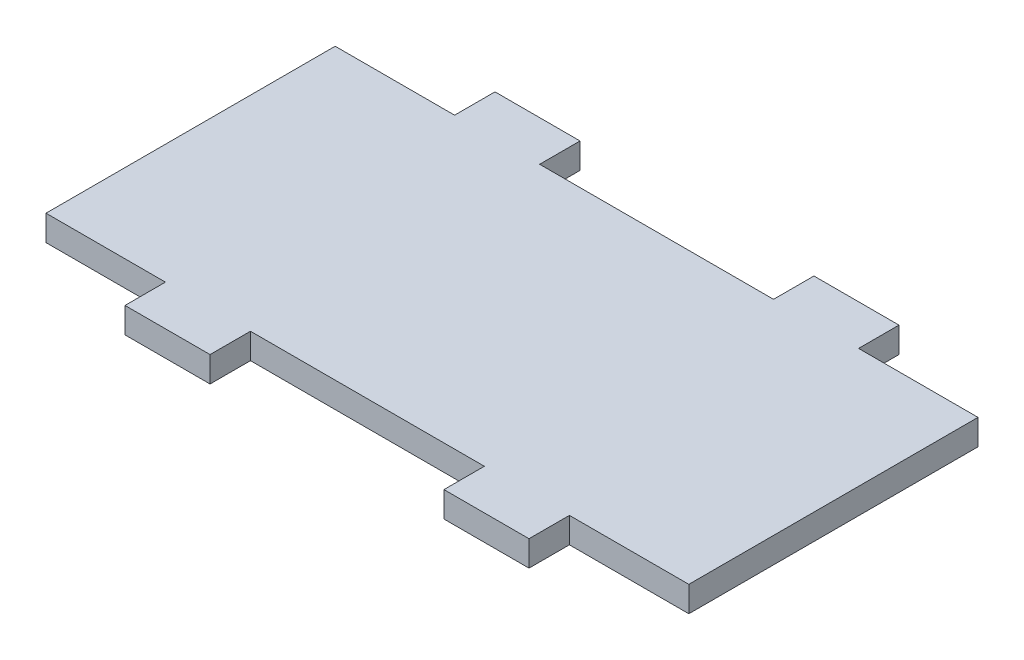
ISO-10303-21;
HEADER;
FILE_DESCRIPTION(('STEP AP214'),'2;1');
FILE_NAME('part.step','',(''),(''),'','','');
FILE_SCHEMA(('AUTOMOTIVE_DESIGN { 1 0 10303 214 1 1 1 1 }'));
ENDSEC;
DATA;
#1=APPLICATION_CONTEXT('core data for automotive mechanical design processes');
#2=APPLICATION_PROTOCOL_DEFINITION('international standard','automotive_design',2000,#1);
#3=PRODUCT_CONTEXT('',#1,'mechanical');
#4=PRODUCT('Part','Part','',(#3));
#5=PRODUCT_RELATED_PRODUCT_CATEGORY('part','',(#4));
#6=PRODUCT_DEFINITION_FORMATION('','',#4);
#7=PRODUCT_DEFINITION_CONTEXT('part definition',#1,'design');
#8=PRODUCT_DEFINITION('design','',#6,#7);
#9=PRODUCT_DEFINITION_SHAPE('','',#8);
#10=(LENGTH_UNIT() NAMED_UNIT(*) SI_UNIT(.MILLI.,.METRE.));
#11=(NAMED_UNIT(*) PLANE_ANGLE_UNIT() SI_UNIT($,.RADIAN.));
#12=(NAMED_UNIT(*) SI_UNIT($,.STERADIAN.) SOLID_ANGLE_UNIT());
#13=UNCERTAINTY_MEASURE_WITH_UNIT(LENGTH_MEASURE(1.E-05),#10,'distance_accuracy_value','');
#14=(GEOMETRIC_REPRESENTATION_CONTEXT(3) GLOBAL_UNCERTAINTY_ASSIGNED_CONTEXT((#13)) GLOBAL_UNIT_ASSIGNED_CONTEXT((#10,
#11,#12)) REPRESENTATION_CONTEXT('',''));
#15=CARTESIAN_POINT('',(0.,0.,0.));
#16=DIRECTION('',(0.,0.,1.));
#17=DIRECTION('',(1.,0.,0.));
#18=AXIS2_PLACEMENT_3D('',#15,#16,#17);
#19=CARTESIAN_POINT('',(13.75,3.,0.));
#20=DIRECTION('',(-1.,0.,0.));
#21=DIRECTION('',(0.,0.,1.));
#22=AXIS2_PLACEMENT_3D('',#19,#20,#21);
#23=PLANE('',#22);
#24=DIRECTION('',(0.,0.,-1.));
#25=VECTOR('',#24,1.);
#26=CARTESIAN_POINT('',(13.75,0.,0.));
#27=LINE('',#26,#25);
#28=CARTESIAN_POINT('',(13.75,0.,-17.));
#29=VERTEX_POINT('',#28);
#30=CARTESIAN_POINT('',(13.75,0.,-21.75));
#31=VERTEX_POINT('',#30);
#32=EDGE_CURVE('E212',#29,#31,#27,.T.);
#33=ORIENTED_EDGE('',*,*,#32,.F.);
#34=DIRECTION('',(0.,-1.,0.));
#35=VECTOR('',#34,1.);
#36=CARTESIAN_POINT('',(13.75,3.,-17.));
#37=LINE('',#36,#35);
#38=CARTESIAN_POINT('',(13.75,3.,-17.));
#39=VERTEX_POINT('',#38);
#40=EDGE_CURVE('E11',#39,#29,#37,.T.);
#41=ORIENTED_EDGE('',*,*,#40,.F.);
#42=DIRECTION('',(0.,0.,-1.));
#43=VECTOR('',#42,1.);
#44=CARTESIAN_POINT('',(13.75,3.,0.));
#45=LINE('',#44,#43);
#46=CARTESIAN_POINT('',(13.75,3.,-21.75));
#47=VERTEX_POINT('',#46);
#48=EDGE_CURVE('E283',#39,#47,#45,.T.);
#49=ORIENTED_EDGE('',*,*,#48,.T.);
#50=DIRECTION('',(0.,-1.,0.));
#51=VECTOR('',#50,1.);
#52=CARTESIAN_POINT('',(13.75,3.,-21.75));
#53=LINE('',#52,#51);
#54=EDGE_CURVE('E57',#47,#31,#53,.T.);
#55=ORIENTED_EDGE('',*,*,#54,.T.);
#56=EDGE_LOOP('',(#33,#41,#49,#55));
#57=FACE_BOUND('',#56,.T.);
#58=ADVANCED_FACE('F40',(#57),#23,.T.);
#59=CARTESIAN_POINT('',(0.,3.,-17.));
#60=DIRECTION('',(0.,0.,1.));
#61=DIRECTION('',(1.,0.,0.));
#62=AXIS2_PLACEMENT_3D('',#59,#60,#61);
#63=PLANE('',#62);
#64=DIRECTION('',(-1.,0.,0.));
#65=VECTOR('',#64,1.);
#66=CARTESIAN_POINT('',(0.,0.,-17.));
#67=LINE('',#66,#65);
#68=CARTESIAN_POINT('',(-13.75,0.,-17.));
#69=VERTEX_POINT('',#68);
#70=EDGE_CURVE('E215',#29,#69,#67,.T.);
#71=ORIENTED_EDGE('',*,*,#70,.T.);
#72=DIRECTION('',(0.,-1.,0.));
#73=VECTOR('',#72,1.);
#74=CARTESIAN_POINT('',(-13.75,3.,-17.));
#75=LINE('',#74,#73);
#76=CARTESIAN_POINT('',(-13.75,3.,-17.));
#77=VERTEX_POINT('',#76);
#78=EDGE_CURVE('E49',#77,#69,#75,.T.);
#79=ORIENTED_EDGE('',*,*,#78,.F.);
#80=DIRECTION('',(-1.,0.,0.));
#81=VECTOR('',#80,1.);
#82=CARTESIAN_POINT('',(0.,3.,-17.));
#83=LINE('',#82,#81);
#84=EDGE_CURVE('E364',#39,#77,#83,.T.);
#85=ORIENTED_EDGE('',*,*,#84,.F.);
#86=ORIENTED_EDGE('',*,*,#40,.T.);
#87=EDGE_LOOP('',(#71,#79,#85,#86));
#88=FACE_BOUND('',#87,.T.);
#89=ADVANCED_FACE('F427',(#88),#63,.F.);
#90=CARTESIAN_POINT('',(-13.75,3.,0.));
#91=DIRECTION('',(-1.,0.,0.));
#92=DIRECTION('',(0.,0.,1.));
#93=AXIS2_PLACEMENT_3D('',#90,#91,#92);
#94=PLANE('',#93);
#95=DIRECTION('',(0.,0.,-1.));
#96=VECTOR('',#95,1.);
#97=CARTESIAN_POINT('',(-13.75,0.,0.));
#98=LINE('',#97,#96);
#99=CARTESIAN_POINT('',(-13.75,0.,-21.75));
#100=VERTEX_POINT('',#99);
#101=EDGE_CURVE('E218',#69,#100,#98,.T.);
#102=ORIENTED_EDGE('',*,*,#101,.T.);
#103=DIRECTION('',(0.,-1.,0.));
#104=VECTOR('',#103,1.);
#105=CARTESIAN_POINT('',(-13.75,3.,-21.75));
#106=LINE('',#105,#104);
#107=CARTESIAN_POINT('',(-13.75,3.,-21.75));
#108=VERTEX_POINT('',#107);
#109=EDGE_CURVE('E332',#108,#100,#106,.T.);
#110=ORIENTED_EDGE('',*,*,#109,.F.);
#111=DIRECTION('',(0.,0.,-1.));
#112=VECTOR('',#111,1.);
#113=CARTESIAN_POINT('',(-13.75,3.,0.));
#114=LINE('',#113,#112);
#115=EDGE_CURVE('E342',#77,#108,#114,.T.);
#116=ORIENTED_EDGE('',*,*,#115,.F.);
#117=ORIENTED_EDGE('',*,*,#78,.T.);
#118=EDGE_LOOP('',(#102,#110,#116,#117));
#119=FACE_BOUND('',#118,.T.);
#120=ADVANCED_FACE('F340',(#119),#94,.F.);
#121=CARTESIAN_POINT('',(0.,3.,-21.75));
#122=DIRECTION('',(0.,0.,-1.));
#123=DIRECTION('',(-1.,0.,0.));
#124=AXIS2_PLACEMENT_3D('',#121,#122,#123);
#125=PLANE('',#124);
#126=DIRECTION('',(1.,0.,0.));
#127=VECTOR('',#126,1.);
#128=CARTESIAN_POINT('',(0.,0.,-21.75));
#129=LINE('',#128,#127);
#130=CARTESIAN_POINT('',(-23.75,0.,-21.75));
#131=VERTEX_POINT('',#130);
#132=EDGE_CURVE('E222',#131,#100,#129,.T.);
#133=ORIENTED_EDGE('',*,*,#132,.F.);
#134=DIRECTION('',(0.,-1.,0.));
#135=VECTOR('',#134,1.);
#136=CARTESIAN_POINT('',(-23.75,3.,-21.75));
#137=LINE('',#136,#135);
#138=CARTESIAN_POINT('',(-23.75,3.,-21.75));
#139=VERTEX_POINT('',#138);
#140=EDGE_CURVE('E329',#139,#131,#137,.T.);
#141=ORIENTED_EDGE('',*,*,#140,.F.);
#142=DIRECTION('',(1.,0.,0.));
#143=VECTOR('',#142,1.);
#144=CARTESIAN_POINT('',(0.,3.,-21.75));
#145=LINE('',#144,#143);
#146=EDGE_CURVE('E354',#139,#108,#145,.T.);
#147=ORIENTED_EDGE('',*,*,#146,.T.);
#148=ORIENTED_EDGE('',*,*,#109,.T.);
#149=EDGE_LOOP('',(#133,#141,#147,#148));
#150=FACE_BOUND('',#149,.T.);
#151=ADVANCED_FACE('F351',(#150),#125,.T.);
#152=CARTESIAN_POINT('',(-23.75,3.,0.));
#153=DIRECTION('',(-1.,0.,0.));
#154=DIRECTION('',(0.,0.,1.));
#155=AXIS2_PLACEMENT_3D('',#152,#153,#154);
#156=PLANE('',#155);
#157=DIRECTION('',(0.,0.,-1.));
#158=VECTOR('',#157,1.);
#159=CARTESIAN_POINT('',(-23.75,0.,0.));
#160=LINE('',#159,#158);
#161=CARTESIAN_POINT('',(-23.75,0.,-17.));
#162=VERTEX_POINT('',#161);
#163=EDGE_CURVE('E226',#162,#131,#160,.T.);
#164=ORIENTED_EDGE('',*,*,#163,.F.);
#165=DIRECTION('',(0.,-1.,0.));
#166=VECTOR('',#165,1.);
#167=CARTESIAN_POINT('',(-23.75,3.,-17.));
#168=LINE('',#167,#166);
#169=CARTESIAN_POINT('',(-23.75,3.,-17.));
#170=VERTEX_POINT('',#169);
#171=EDGE_CURVE('E326',#170,#162,#168,.T.);
#172=ORIENTED_EDGE('',*,*,#171,.F.);
#173=DIRECTION('',(0.,0.,-1.));
#174=VECTOR('',#173,1.);
#175=CARTESIAN_POINT('',(-23.75,3.,0.));
#176=LINE('',#175,#174);
#177=EDGE_CURVE('E358',#170,#139,#176,.T.);
#178=ORIENTED_EDGE('',*,*,#177,.T.);
#179=ORIENTED_EDGE('',*,*,#140,.T.);
#180=EDGE_LOOP('',(#164,#172,#178,#179));
#181=FACE_BOUND('',#180,.T.);
#182=ADVANCED_FACE('F575',(#181),#156,.T.);
#183=CARTESIAN_POINT('',(0.,3.,-17.));
#184=DIRECTION('',(0.,0.,1.));
#185=DIRECTION('',(1.,0.,0.));
#186=AXIS2_PLACEMENT_3D('',#183,#184,#185);
#187=PLANE('',#186);
#188=DIRECTION('',(-1.,0.,0.));
#189=VECTOR('',#188,1.);
#190=CARTESIAN_POINT('',(0.,0.,-17.));
#191=LINE('',#190,#189);
#192=CARTESIAN_POINT('',(-37.79,0.,-17.));
#193=VERTEX_POINT('',#192);
#194=EDGE_CURVE('E230',#162,#193,#191,.T.);
#195=ORIENTED_EDGE('',*,*,#194,.T.);
#196=DIRECTION('',(0.,-1.,0.));
#197=VECTOR('',#196,1.);
#198=CARTESIAN_POINT('',(-37.79,3.,-17.));
#199=LINE('',#198,#197);
#200=CARTESIAN_POINT('',(-37.79,3.,-17.));
#201=VERTEX_POINT('',#200);
#202=EDGE_CURVE('E323',#201,#193,#199,.T.);
#203=ORIENTED_EDGE('',*,*,#202,.F.);
#204=DIRECTION('',(-1.,0.,0.));
#205=VECTOR('',#204,1.);
#206=CARTESIAN_POINT('',(0.,3.,-17.));
#207=LINE('',#206,#205);
#208=EDGE_CURVE('E362',#170,#201,#207,.T.);
#209=ORIENTED_EDGE('',*,*,#208,.F.);
#210=ORIENTED_EDGE('',*,*,#171,.T.);
#211=EDGE_LOOP('',(#195,#203,#209,#210));
#212=FACE_BOUND('',#211,.T.);
#213=ADVANCED_FACE('F565',(#212),#187,.F.);
#214=CARTESIAN_POINT('',(-37.79,3.,0.));
#215=DIRECTION('',(-1.,0.,0.));
#216=DIRECTION('',(0.,0.,1.));
#217=AXIS2_PLACEMENT_3D('',#214,#215,#216);
#218=PLANE('',#217);
#219=DIRECTION('',(0.,0.,-1.));
#220=VECTOR('',#219,1.);
#221=CARTESIAN_POINT('',(-37.79,0.,0.));
#222=LINE('',#221,#220);
#223=CARTESIAN_POINT('',(-37.79,0.,17.));
#224=VERTEX_POINT('',#223);
#225=EDGE_CURVE('E234',#224,#193,#222,.T.);
#226=ORIENTED_EDGE('',*,*,#225,.F.);
#227=DIRECTION('',(0.,-1.,0.));
#228=VECTOR('',#227,1.);
#229=CARTESIAN_POINT('',(-37.79,3.,17.));
#230=LINE('',#229,#228);
#231=CARTESIAN_POINT('',(-37.79,3.,17.));
#232=VERTEX_POINT('',#231);
#233=EDGE_CURVE('E320',#232,#224,#230,.T.);
#234=ORIENTED_EDGE('',*,*,#233,.F.);
#235=DIRECTION('',(0.,0.,-1.));
#236=VECTOR('',#235,1.);
#237=CARTESIAN_POINT('',(-37.79,3.,0.));
#238=LINE('',#237,#236);
#239=EDGE_CURVE('E370',#232,#201,#238,.T.);
#240=ORIENTED_EDGE('',*,*,#239,.T.);
#241=ORIENTED_EDGE('',*,*,#202,.T.);
#242=EDGE_LOOP('',(#226,#234,#240,#241));
#243=FACE_BOUND('',#242,.T.);
#244=ADVANCED_FACE('F554',(#243),#218,.T.);
#245=CARTESIAN_POINT('',(0.,3.,17.));
#246=DIRECTION('',(0.,0.,-1.));
#247=DIRECTION('',(-1.,0.,0.));
#248=AXIS2_PLACEMENT_3D('',#245,#246,#247);
#249=PLANE('',#248);
#250=DIRECTION('',(1.,0.,0.));
#251=VECTOR('',#250,1.);
#252=CARTESIAN_POINT('',(0.,0.,17.));
#253=LINE('',#252,#251);
#254=CARTESIAN_POINT('',(-23.75,0.,17.));
#255=VERTEX_POINT('',#254);
#256=EDGE_CURVE('E238',#224,#255,#253,.T.);
#257=ORIENTED_EDGE('',*,*,#256,.T.);
#258=DIRECTION('',(0.,-1.,0.));
#259=VECTOR('',#258,1.);
#260=CARTESIAN_POINT('',(-23.75,3.,17.));
#261=LINE('',#260,#259);
#262=CARTESIAN_POINT('',(-23.75,3.,17.));
#263=VERTEX_POINT('',#262);
#264=EDGE_CURVE('E316',#263,#255,#261,.T.);
#265=ORIENTED_EDGE('',*,*,#264,.F.);
#266=DIRECTION('',(1.,0.,0.));
#267=VECTOR('',#266,1.);
#268=CARTESIAN_POINT('',(0.,3.,17.));
#269=LINE('',#268,#267);
#270=EDGE_CURVE('E374',#232,#263,#269,.T.);
#271=ORIENTED_EDGE('',*,*,#270,.F.);
#272=ORIENTED_EDGE('',*,*,#233,.T.);
#273=EDGE_LOOP('',(#257,#265,#271,#272));
#274=FACE_BOUND('',#273,.T.);
#275=ADVANCED_FACE('F544',(#274),#249,.F.);
#276=CARTESIAN_POINT('',(-23.75,3.,0.));
#277=DIRECTION('',(1.,0.,0.));
#278=DIRECTION('',(0.,0.,-1.));
#279=AXIS2_PLACEMENT_3D('',#276,#277,#278);
#280=PLANE('',#279);
#281=DIRECTION('',(0.,0.,1.));
#282=VECTOR('',#281,1.);
#283=CARTESIAN_POINT('',(-23.75,0.,0.));
#284=LINE('',#283,#282);
#285=CARTESIAN_POINT('',(-23.75,0.,21.75));
#286=VERTEX_POINT('',#285);
#287=EDGE_CURVE('E241',#255,#286,#284,.T.);
#288=ORIENTED_EDGE('',*,*,#287,.T.);
#289=DIRECTION('',(0.,-1.,0.));
#290=VECTOR('',#289,1.);
#291=CARTESIAN_POINT('',(-23.75,3.,21.75));
#292=LINE('',#291,#290);
#293=CARTESIAN_POINT('',(-23.75,3.,21.75));
#294=VERTEX_POINT('',#293);
#295=EDGE_CURVE('E312',#294,#286,#292,.T.);
#296=ORIENTED_EDGE('',*,*,#295,.F.);
#297=DIRECTION('',(0.,0.,1.));
#298=VECTOR('',#297,1.);
#299=CARTESIAN_POINT('',(-23.75,3.,0.));
#300=LINE('',#299,#298);
#301=EDGE_CURVE('E377',#263,#294,#300,.T.);
#302=ORIENTED_EDGE('',*,*,#301,.F.);
#303=ORIENTED_EDGE('',*,*,#264,.T.);
#304=EDGE_LOOP('',(#288,#296,#302,#303));
#305=FACE_BOUND('',#304,.T.);
#306=ADVANCED_FACE('F534',(#305),#280,.F.);
#307=CARTESIAN_POINT('',(0.,3.,21.75));
#308=DIRECTION('',(0.,0.,-1.));
#309=DIRECTION('',(-1.,0.,0.));
#310=AXIS2_PLACEMENT_3D('',#307,#308,#309);
#311=PLANE('',#310);
#312=DIRECTION('',(1.,0.,0.));
#313=VECTOR('',#312,1.);
#314=CARTESIAN_POINT('',(0.,0.,21.75));
#315=LINE('',#314,#313);
#316=CARTESIAN_POINT('',(-13.75,0.,21.75));
#317=VERTEX_POINT('',#316);
#318=EDGE_CURVE('E244',#286,#317,#315,.T.);
#319=ORIENTED_EDGE('',*,*,#318,.T.);
#320=DIRECTION('',(0.,-1.,0.));
#321=VECTOR('',#320,1.);
#322=CARTESIAN_POINT('',(-13.75,3.,21.75));
#323=LINE('',#322,#321);
#324=CARTESIAN_POINT('',(-13.75,3.,21.75));
#325=VERTEX_POINT('',#324);
#326=EDGE_CURVE('E309',#325,#317,#323,.T.);
#327=ORIENTED_EDGE('',*,*,#326,.F.);
#328=DIRECTION('',(1.,0.,0.));
#329=VECTOR('',#328,1.);
#330=CARTESIAN_POINT('',(0.,3.,21.75));
#331=LINE('',#330,#329);
#332=EDGE_CURVE('E380',#294,#325,#331,.T.);
#333=ORIENTED_EDGE('',*,*,#332,.F.);
#334=ORIENTED_EDGE('',*,*,#295,.T.);
#335=EDGE_LOOP('',(#319,#327,#333,#334));
#336=FACE_BOUND('',#335,.T.);
#337=ADVANCED_FACE('F524',(#336),#311,.F.);
#338=CARTESIAN_POINT('',(-13.75,3.,0.));
#339=DIRECTION('',(1.,0.,0.));
#340=DIRECTION('',(0.,0.,-1.));
#341=AXIS2_PLACEMENT_3D('',#338,#339,#340);
#342=PLANE('',#341);
#343=DIRECTION('',(0.,0.,1.));
#344=VECTOR('',#343,1.);
#345=CARTESIAN_POINT('',(-13.75,0.,0.));
#346=LINE('',#345,#344);
#347=CARTESIAN_POINT('',(-13.75,0.,17.));
#348=VERTEX_POINT('',#347);
#349=EDGE_CURVE('E248',#348,#317,#346,.T.);
#350=ORIENTED_EDGE('',*,*,#349,.F.);
#351=DIRECTION('',(0.,-1.,0.));
#352=VECTOR('',#351,1.);
#353=CARTESIAN_POINT('',(-13.75,3.,17.));
#354=LINE('',#353,#352);
#355=CARTESIAN_POINT('',(-13.75,3.,17.));
#356=VERTEX_POINT('',#355);
#357=EDGE_CURVE('E306',#356,#348,#354,.T.);
#358=ORIENTED_EDGE('',*,*,#357,.F.);
#359=DIRECTION('',(0.,0.,1.));
#360=VECTOR('',#359,1.);
#361=CARTESIAN_POINT('',(-13.75,3.,0.));
#362=LINE('',#361,#360);
#363=EDGE_CURVE('E383',#356,#325,#362,.T.);
#364=ORIENTED_EDGE('',*,*,#363,.T.);
#365=ORIENTED_EDGE('',*,*,#326,.T.);
#366=EDGE_LOOP('',(#350,#358,#364,#365));
#367=FACE_BOUND('',#366,.T.);
#368=ADVANCED_FACE('F513',(#367),#342,.T.);
#369=CARTESIAN_POINT('',(0.,3.,17.));
#370=DIRECTION('',(0.,0.,1.));
#371=DIRECTION('',(1.,0.,0.));
#372=AXIS2_PLACEMENT_3D('',#369,#370,#371);
#373=PLANE('',#372);
#374=DIRECTION('',(-1.,0.,0.));
#375=VECTOR('',#374,1.);
#376=CARTESIAN_POINT('',(0.,0.,17.));
#377=LINE('',#376,#375);
#378=CARTESIAN_POINT('',(13.75,0.,17.));
#379=VERTEX_POINT('',#378);
#380=EDGE_CURVE('E252',#379,#348,#377,.T.);
#381=ORIENTED_EDGE('',*,*,#380,.F.);
#382=DIRECTION('',(0.,-1.,0.));
#383=VECTOR('',#382,1.);
#384=CARTESIAN_POINT('',(13.75,3.,17.));
#385=LINE('',#384,#383);
#386=CARTESIAN_POINT('',(13.75,3.,17.));
#387=VERTEX_POINT('',#386);
#388=EDGE_CURVE('E303',#387,#379,#385,.T.);
#389=ORIENTED_EDGE('',*,*,#388,.F.);
#390=DIRECTION('',(-1.,0.,0.));
#391=VECTOR('',#390,1.);
#392=CARTESIAN_POINT('',(0.,3.,17.));
#393=LINE('',#392,#391);
#394=EDGE_CURVE('E387',#387,#356,#393,.T.);
#395=ORIENTED_EDGE('',*,*,#394,.T.);
#396=ORIENTED_EDGE('',*,*,#357,.T.);
#397=EDGE_LOOP('',(#381,#389,#395,#396));
#398=FACE_BOUND('',#397,.T.);
#399=ADVANCED_FACE('F503',(#398),#373,.T.);
#400=CARTESIAN_POINT('',(13.75,3.,0.));
#401=DIRECTION('',(1.,0.,0.));
#402=DIRECTION('',(0.,0.,-1.));
#403=AXIS2_PLACEMENT_3D('',#400,#401,#402);
#404=PLANE('',#403);
#405=DIRECTION('',(0.,0.,1.));
#406=VECTOR('',#405,1.);
#407=CARTESIAN_POINT('',(13.75,0.,0.));
#408=LINE('',#407,#406);
#409=CARTESIAN_POINT('',(13.75,0.,21.75));
#410=VERTEX_POINT('',#409);
#411=EDGE_CURVE('E256',#379,#410,#408,.T.);
#412=ORIENTED_EDGE('',*,*,#411,.T.);
#413=DIRECTION('',(0.,-1.,0.));
#414=VECTOR('',#413,1.);
#415=CARTESIAN_POINT('',(13.75,3.,21.75));
#416=LINE('',#415,#414);
#417=CARTESIAN_POINT('',(13.75,3.,21.75));
#418=VERTEX_POINT('',#417);
#419=EDGE_CURVE('E299',#418,#410,#416,.T.);
#420=ORIENTED_EDGE('',*,*,#419,.F.);
#421=DIRECTION('',(0.,0.,1.));
#422=VECTOR('',#421,1.);
#423=CARTESIAN_POINT('',(13.75,3.,0.));
#424=LINE('',#423,#422);
#425=EDGE_CURVE('E391',#387,#418,#424,.T.);
#426=ORIENTED_EDGE('',*,*,#425,.F.);
#427=ORIENTED_EDGE('',*,*,#388,.T.);
#428=EDGE_LOOP('',(#412,#420,#426,#427));
#429=FACE_BOUND('',#428,.T.);
#430=ADVANCED_FACE('F493',(#429),#404,.F.);
#431=CARTESIAN_POINT('',(0.,3.,21.75));
#432=DIRECTION('',(0.,0.,-1.));
#433=DIRECTION('',(-1.,0.,0.));
#434=AXIS2_PLACEMENT_3D('',#431,#432,#433);
#435=PLANE('',#434);
#436=DIRECTION('',(1.,0.,0.));
#437=VECTOR('',#436,1.);
#438=CARTESIAN_POINT('',(0.,0.,21.75));
#439=LINE('',#438,#437);
#440=CARTESIAN_POINT('',(23.75,0.,21.75));
#441=VERTEX_POINT('',#440);
#442=EDGE_CURVE('E259',#410,#441,#439,.T.);
#443=ORIENTED_EDGE('',*,*,#442,.T.);
#444=DIRECTION('',(0.,-1.,0.));
#445=VECTOR('',#444,1.);
#446=CARTESIAN_POINT('',(23.75,3.,21.75));
#447=LINE('',#446,#445);
#448=CARTESIAN_POINT('',(23.75,3.,21.75));
#449=VERTEX_POINT('',#448);
#450=EDGE_CURVE('E296',#449,#441,#447,.T.);
#451=ORIENTED_EDGE('',*,*,#450,.F.);
#452=DIRECTION('',(1.,0.,0.));
#453=VECTOR('',#452,1.);
#454=CARTESIAN_POINT('',(0.,3.,21.75));
#455=LINE('',#454,#453);
#456=EDGE_CURVE('E394',#418,#449,#455,.T.);
#457=ORIENTED_EDGE('',*,*,#456,.F.);
#458=ORIENTED_EDGE('',*,*,#419,.T.);
#459=EDGE_LOOP('',(#443,#451,#457,#458));
#460=FACE_BOUND('',#459,.T.);
#461=ADVANCED_FACE('F484',(#460),#435,.F.);
#462=CARTESIAN_POINT('',(23.75,3.,0.));
#463=DIRECTION('',(1.,0.,0.));
#464=DIRECTION('',(0.,0.,-1.));
#465=AXIS2_PLACEMENT_3D('',#462,#463,#464);
#466=PLANE('',#465);
#467=DIRECTION('',(0.,0.,1.));
#468=VECTOR('',#467,1.);
#469=CARTESIAN_POINT('',(23.75,0.,0.));
#470=LINE('',#469,#468);
#471=CARTESIAN_POINT('',(23.75,0.,17.));
#472=VERTEX_POINT('',#471);
#473=EDGE_CURVE('E263',#472,#441,#470,.T.);
#474=ORIENTED_EDGE('',*,*,#473,.F.);
#475=DIRECTION('',(0.,-1.,0.));
#476=VECTOR('',#475,1.);
#477=CARTESIAN_POINT('',(23.75,3.,17.));
#478=LINE('',#477,#476);
#479=CARTESIAN_POINT('',(23.75,3.,17.));
#480=VERTEX_POINT('',#479);
#481=EDGE_CURVE('E293',#480,#472,#478,.T.);
#482=ORIENTED_EDGE('',*,*,#481,.F.);
#483=DIRECTION('',(0.,0.,1.));
#484=VECTOR('',#483,1.);
#485=CARTESIAN_POINT('',(23.75,3.,0.));
#486=LINE('',#485,#484);
#487=EDGE_CURVE('E397',#480,#449,#486,.T.);
#488=ORIENTED_EDGE('',*,*,#487,.T.);
#489=ORIENTED_EDGE('',*,*,#450,.T.);
#490=EDGE_LOOP('',(#474,#482,#488,#489));
#491=FACE_BOUND('',#490,.T.);
#492=ADVANCED_FACE('F413',(#491),#466,.T.);
#493=CARTESIAN_POINT('',(0.,3.,17.));
#494=DIRECTION('',(0.,0.,1.));
#495=DIRECTION('',(1.,0.,0.));
#496=AXIS2_PLACEMENT_3D('',#493,#494,#495);
#497=PLANE('',#496);
#498=DIRECTION('',(-1.,0.,0.));
#499=VECTOR('',#498,1.);
#500=CARTESIAN_POINT('',(0.,0.,17.));
#501=LINE('',#500,#499);
#502=CARTESIAN_POINT('',(37.79,0.,17.));
#503=VERTEX_POINT('',#502);
#504=EDGE_CURVE('E267',#503,#472,#501,.T.);
#505=ORIENTED_EDGE('',*,*,#504,.F.);
#506=DIRECTION('',(0.,-1.,0.));
#507=VECTOR('',#506,1.);
#508=CARTESIAN_POINT('',(37.79,3.,17.));
#509=LINE('',#508,#507);
#510=CARTESIAN_POINT('',(37.79,3.,17.));
#511=VERTEX_POINT('',#510);
#512=EDGE_CURVE('E290',#511,#503,#509,.T.);
#513=ORIENTED_EDGE('',*,*,#512,.F.);
#514=DIRECTION('',(-1.,0.,0.));
#515=VECTOR('',#514,1.);
#516=CARTESIAN_POINT('',(0.,3.,17.));
#517=LINE('',#516,#515);
#518=EDGE_CURVE('E401',#511,#480,#517,.T.);
#519=ORIENTED_EDGE('',*,*,#518,.T.);
#520=ORIENTED_EDGE('',*,*,#481,.T.);
#521=EDGE_LOOP('',(#505,#513,#519,#520));
#522=FACE_BOUND('',#521,.T.);
#523=ADVANCED_FACE('F407',(#522),#497,.T.);
#524=CARTESIAN_POINT('',(37.79,3.,0.));
#525=DIRECTION('',(-1.,0.,0.));
#526=DIRECTION('',(0.,0.,1.));
#527=AXIS2_PLACEMENT_3D('',#524,#525,#526);
#528=PLANE('',#527);
#529=DIRECTION('',(0.,0.,-1.));
#530=VECTOR('',#529,1.);
#531=CARTESIAN_POINT('',(37.79,0.,0.));
#532=LINE('',#531,#530);
#533=CARTESIAN_POINT('',(37.79,0.,-17.));
#534=VERTEX_POINT('',#533);
#535=EDGE_CURVE('E271',#503,#534,#532,.T.);
#536=ORIENTED_EDGE('',*,*,#535,.T.);
#537=DIRECTION('',(0.,-1.,0.));
#538=VECTOR('',#537,1.);
#539=CARTESIAN_POINT('',(37.79,3.,-17.));
#540=LINE('',#539,#538);
#541=CARTESIAN_POINT('',(37.79,3.,-17.));
#542=VERTEX_POINT('',#541);
#543=EDGE_CURVE('E202',#542,#534,#540,.T.);
#544=ORIENTED_EDGE('',*,*,#543,.F.);
#545=DIRECTION('',(0.,0.,-1.));
#546=VECTOR('',#545,1.);
#547=CARTESIAN_POINT('',(37.79,3.,0.));
#548=LINE('',#547,#546);
#549=EDGE_CURVE('E188',#511,#542,#548,.T.);
#550=ORIENTED_EDGE('',*,*,#549,.F.);
#551=ORIENTED_EDGE('',*,*,#512,.T.);
#552=EDGE_LOOP('',(#536,#544,#550,#551));
#553=FACE_BOUND('',#552,.T.);
#554=ADVANCED_FACE('F417',(#553),#528,.F.);
#555=CARTESIAN_POINT('',(0.,3.,-17.));
#556=DIRECTION('',(0.,0.,1.));
#557=DIRECTION('',(1.,0.,0.));
#558=AXIS2_PLACEMENT_3D('',#555,#556,#557);
#559=PLANE('',#558);
#560=DIRECTION('',(-1.,0.,0.));
#561=VECTOR('',#560,1.);
#562=CARTESIAN_POINT('',(0.,0.,-17.));
#563=LINE('',#562,#561);
#564=CARTESIAN_POINT('',(23.75,0.,-17.));
#565=VERTEX_POINT('',#564);
#566=EDGE_CURVE('E198',#534,#565,#563,.T.);
#567=ORIENTED_EDGE('',*,*,#566,.T.);
#568=DIRECTION('',(0.,-1.,0.));
#569=VECTOR('',#568,1.);
#570=CARTESIAN_POINT('',(23.75,3.,-17.));
#571=LINE('',#570,#569);
#572=CARTESIAN_POINT('',(23.75,3.,-17.));
#573=VERTEX_POINT('',#572);
#574=EDGE_CURVE('E195',#573,#565,#571,.T.);
#575=ORIENTED_EDGE('',*,*,#574,.F.);
#576=DIRECTION('',(-1.,0.,0.));
#577=VECTOR('',#576,1.);
#578=CARTESIAN_POINT('',(0.,3.,-17.));
#579=LINE('',#578,#577);
#580=EDGE_CURVE('E179',#542,#573,#579,.T.);
#581=ORIENTED_EDGE('',*,*,#580,.F.);
#582=ORIENTED_EDGE('',*,*,#543,.T.);
#583=EDGE_LOOP('',(#567,#575,#581,#582));
#584=FACE_BOUND('',#583,.T.);
#585=ADVANCED_FACE('F196',(#584),#559,.F.);
#586=CARTESIAN_POINT('',(23.75,3.,0.));
#587=DIRECTION('',(-1.,0.,0.));
#588=DIRECTION('',(0.,0.,1.));
#589=AXIS2_PLACEMENT_3D('',#586,#587,#588);
#590=PLANE('',#589);
#591=DIRECTION('',(0.,0.,-1.));
#592=VECTOR('',#591,1.);
#593=CARTESIAN_POINT('',(23.75,0.,0.));
#594=LINE('',#593,#592);
#595=CARTESIAN_POINT('',(23.75,0.,-21.75));
#596=VERTEX_POINT('',#595);
#597=EDGE_CURVE('E276',#565,#596,#594,.T.);
#598=ORIENTED_EDGE('',*,*,#597,.T.);
#599=DIRECTION('',(0.,-1.,0.));
#600=VECTOR('',#599,1.);
#601=CARTESIAN_POINT('',(23.75,3.,-21.75));
#602=LINE('',#601,#600);
#603=CARTESIAN_POINT('',(23.75,3.,-21.75));
#604=VERTEX_POINT('',#603);
#605=EDGE_CURVE('E119',#604,#596,#602,.T.);
#606=ORIENTED_EDGE('',*,*,#605,.F.);
#607=DIRECTION('',(0.,0.,-1.));
#608=VECTOR('',#607,1.);
#609=CARTESIAN_POINT('',(23.75,3.,0.));
#610=LINE('',#609,#608);
#611=EDGE_CURVE('E185',#573,#604,#610,.T.);
#612=ORIENTED_EDGE('',*,*,#611,.F.);
#613=ORIENTED_EDGE('',*,*,#574,.T.);
#614=EDGE_LOOP('',(#598,#606,#612,#613));
#615=FACE_BOUND('',#614,.T.);
#616=ADVANCED_FACE('F204',(#615),#590,.F.);
#617=CARTESIAN_POINT('',(0.,3.,-21.75));
#618=DIRECTION('',(0.,0.,-1.));
#619=DIRECTION('',(-1.,0.,0.));
#620=AXIS2_PLACEMENT_3D('',#617,#618,#619);
#621=PLANE('',#620);
#622=DIRECTION('',(1.,0.,0.));
#623=VECTOR('',#622,1.);
#624=CARTESIAN_POINT('',(0.,0.,-21.75));
#625=LINE('',#624,#623);
#626=EDGE_CURVE('E279',#31,#596,#625,.T.);
#627=ORIENTED_EDGE('',*,*,#626,.F.);
#628=ORIENTED_EDGE('',*,*,#54,.F.);
#629=DIRECTION('',(1.,0.,0.));
#630=VECTOR('',#629,1.);
#631=CARTESIAN_POINT('',(0.,3.,-21.75));
#632=LINE('',#631,#630);
#633=EDGE_CURVE('E206',#47,#604,#632,.T.);
#634=ORIENTED_EDGE('',*,*,#633,.T.);
#635=ORIENTED_EDGE('',*,*,#605,.T.);
#636=EDGE_LOOP('',(#627,#628,#634,#635));
#637=FACE_BOUND('',#636,.T.);
#638=ADVANCED_FACE('F431',(#637),#621,.T.);
#639=CARTESIAN_POINT('',(0.,3.,0.));
#640=DIRECTION('',(0.,1.,0.));
#641=DIRECTION('',(0.,0.,1.));
#642=AXIS2_PLACEMENT_3D('',#639,#640,#641);
#643=PLANE('',#642);
#644=ORIENTED_EDGE('',*,*,#48,.F.);
#645=ORIENTED_EDGE('',*,*,#84,.T.);
#646=ORIENTED_EDGE('',*,*,#115,.T.);
#647=ORIENTED_EDGE('',*,*,#146,.F.);
#648=ORIENTED_EDGE('',*,*,#177,.F.);
#649=ORIENTED_EDGE('',*,*,#208,.T.);
#650=ORIENTED_EDGE('',*,*,#239,.F.);
#651=ORIENTED_EDGE('',*,*,#270,.T.);
#652=ORIENTED_EDGE('',*,*,#301,.T.);
#653=ORIENTED_EDGE('',*,*,#332,.T.);
#654=ORIENTED_EDGE('',*,*,#363,.F.);
#655=ORIENTED_EDGE('',*,*,#394,.F.);
#656=ORIENTED_EDGE('',*,*,#425,.T.);
#657=ORIENTED_EDGE('',*,*,#456,.T.);
#658=ORIENTED_EDGE('',*,*,#487,.F.);
#659=ORIENTED_EDGE('',*,*,#518,.F.);
#660=ORIENTED_EDGE('',*,*,#549,.T.);
#661=ORIENTED_EDGE('',*,*,#580,.T.);
#662=ORIENTED_EDGE('',*,*,#611,.T.);
#663=ORIENTED_EDGE('',*,*,#633,.F.);
#664=EDGE_LOOP('',(#644,#645,#646,#647,#648,#649,#650,#651,#652,#653,#654,#655,#656,#657,#658,
#659,#660,#661,#662,#663));
#665=FACE_BOUND('',#664,.T.);
#666=ADVANCED_FACE('F182',(#665),#643,.T.);
#667=CARTESIAN_POINT('',(0.,0.,0.));
#668=DIRECTION('',(0.,1.,0.));
#669=DIRECTION('',(0.,0.,1.));
#670=AXIS2_PLACEMENT_3D('',#667,#668,#669);
#671=PLANE('',#670);
#672=ORIENTED_EDGE('',*,*,#32,.T.);
#673=ORIENTED_EDGE('',*,*,#626,.T.);
#674=ORIENTED_EDGE('',*,*,#597,.F.);
#675=ORIENTED_EDGE('',*,*,#566,.F.);
#676=ORIENTED_EDGE('',*,*,#535,.F.);
#677=ORIENTED_EDGE('',*,*,#504,.T.);
#678=ORIENTED_EDGE('',*,*,#473,.T.);
#679=ORIENTED_EDGE('',*,*,#442,.F.);
#680=ORIENTED_EDGE('',*,*,#411,.F.);
#681=ORIENTED_EDGE('',*,*,#380,.T.);
#682=ORIENTED_EDGE('',*,*,#349,.T.);
#683=ORIENTED_EDGE('',*,*,#318,.F.);
#684=ORIENTED_EDGE('',*,*,#287,.F.);
#685=ORIENTED_EDGE('',*,*,#256,.F.);
#686=ORIENTED_EDGE('',*,*,#225,.T.);
#687=ORIENTED_EDGE('',*,*,#194,.F.);
#688=ORIENTED_EDGE('',*,*,#163,.T.);
#689=ORIENTED_EDGE('',*,*,#132,.T.);
#690=ORIENTED_EDGE('',*,*,#101,.F.);
#691=ORIENTED_EDGE('',*,*,#70,.F.);
#692=EDGE_LOOP('',(#672,#673,#674,#675,#676,#677,#678,#679,#680,#681,#682,#683,#684,#685,#686,
#687,#688,#689,#690,#691));
#693=FACE_BOUND('',#692,.T.);
#694=ADVANCED_FACE('F346',(#693),#671,.F.);
#695=CLOSED_SHELL('',(#58,#89,#120,#151,#182,#213,#244,#275,#306,#337,#368,#399,#430,#461,#492,
#523,#554,#585,#616,#638,#666,#694));
#696=MANIFOLD_SOLID_BREP('B2',#695);
#697=ADVANCED_BREP_SHAPE_REPRESENTATION('',(#18,#696),#14);
#698=SHAPE_DEFINITION_REPRESENTATION(#9,#697);
ENDSEC;
END-ISO-10303-21;
